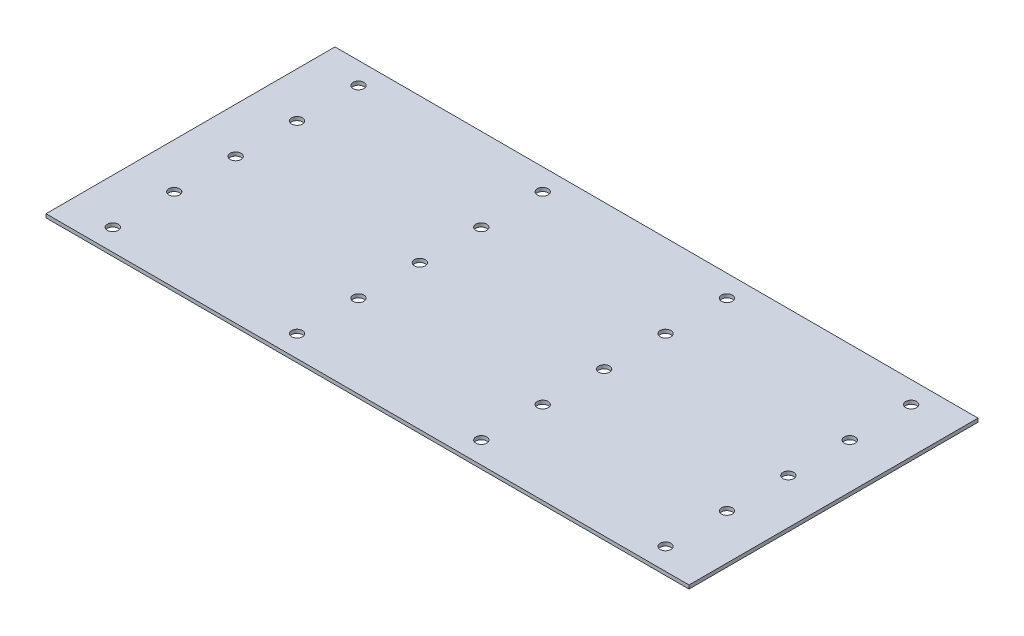
ISO-10303-21;
HEADER;
FILE_DESCRIPTION(('STEP AP214'),'2;1');
FILE_NAME('part.step','',(''),(''),'','','');
FILE_SCHEMA(('AUTOMOTIVE_DESIGN { 1 0 10303 214 1 1 1 1 }'));
ENDSEC;
DATA;
#1=APPLICATION_CONTEXT('core data for automotive mechanical design processes');
#2=APPLICATION_PROTOCOL_DEFINITION('international standard','automotive_design',2000,#1);
#3=PRODUCT_CONTEXT('',#1,'mechanical');
#4=PRODUCT('Part','Part','',(#3));
#5=PRODUCT_RELATED_PRODUCT_CATEGORY('part','',(#4));
#6=PRODUCT_DEFINITION_FORMATION('','',#4);
#7=PRODUCT_DEFINITION_CONTEXT('part definition',#1,'design');
#8=PRODUCT_DEFINITION('design','',#6,#7);
#9=PRODUCT_DEFINITION_SHAPE('','',#8);
#10=(LENGTH_UNIT() NAMED_UNIT(*) SI_UNIT(.MILLI.,.METRE.));
#11=(NAMED_UNIT(*) PLANE_ANGLE_UNIT() SI_UNIT($,.RADIAN.));
#12=(NAMED_UNIT(*) SI_UNIT($,.STERADIAN.) SOLID_ANGLE_UNIT());
#13=UNCERTAINTY_MEASURE_WITH_UNIT(LENGTH_MEASURE(1.E-05),#10,'distance_accuracy_value','');
#14=(GEOMETRIC_REPRESENTATION_CONTEXT(3) GLOBAL_UNCERTAINTY_ASSIGNED_CONTEXT((#13)) GLOBAL_UNIT_ASSIGNED_CONTEXT((#10,
#11,#12)) REPRESENTATION_CONTEXT('',''));
#15=CARTESIAN_POINT('',(0.,0.,0.));
#16=DIRECTION('',(0.,0.,1.));
#17=DIRECTION('',(1.,0.,0.));
#18=AXIS2_PLACEMENT_3D('',#15,#16,#17);
#19=CARTESIAN_POINT('',(89.,1.,40.));
#20=DIRECTION('',(-1.,0.,0.));
#21=DIRECTION('',(0.,0.,1.));
#22=AXIS2_PLACEMENT_3D('',#19,#20,#21);
#23=PLANE('',#22);
#24=DIRECTION('',(0.,0.,-1.));
#25=VECTOR('',#24,1.);
#26=CARTESIAN_POINT('',(89.,0.,40.));
#27=LINE('',#26,#25);
#28=CARTESIAN_POINT('',(89.,0.,40.));
#29=VERTEX_POINT('',#28);
#30=CARTESIAN_POINT('',(89.,0.,-40.));
#31=VERTEX_POINT('',#30);
#32=EDGE_CURVE('E102',#29,#31,#27,.T.);
#33=ORIENTED_EDGE('',*,*,#32,.T.);
#34=DIRECTION('',(0.,-1.,0.));
#35=VECTOR('',#34,1.);
#36=CARTESIAN_POINT('',(89.,1.,-40.));
#37=LINE('',#36,#35);
#38=CARTESIAN_POINT('',(89.,1.,-40.));
#39=VERTEX_POINT('',#38);
#40=EDGE_CURVE('E11',#39,#31,#37,.T.);
#41=ORIENTED_EDGE('',*,*,#40,.F.);
#42=DIRECTION('',(0.,0.,-1.));
#43=VECTOR('',#42,1.);
#44=CARTESIAN_POINT('',(89.,1.,40.));
#45=LINE('',#44,#43);
#46=CARTESIAN_POINT('',(89.,1.,40.));
#47=VERTEX_POINT('',#46);
#48=EDGE_CURVE('E90',#47,#39,#45,.T.);
#49=ORIENTED_EDGE('',*,*,#48,.F.);
#50=DIRECTION('',(0.,-1.,0.));
#51=VECTOR('',#50,1.);
#52=CARTESIAN_POINT('',(89.,1.,40.));
#53=LINE('',#52,#51);
#54=EDGE_CURVE('E98',#47,#29,#53,.T.);
#55=ORIENTED_EDGE('',*,*,#54,.T.);
#56=EDGE_LOOP('',(#33,#41,#49,#55));
#57=FACE_BOUND('',#56,.T.);
#58=ADVANCED_FACE('F39',(#57),#23,.F.);
#59=CARTESIAN_POINT('',(-89.,1.,-40.));
#60=DIRECTION('',(0.,0.,1.));
#61=DIRECTION('',(1.,0.,0.));
#62=AXIS2_PLACEMENT_3D('',#59,#60,#61);
#63=PLANE('',#62);
#64=DIRECTION('',(-1.,0.,0.));
#65=VECTOR('',#64,1.);
#66=CARTESIAN_POINT('',(-89.,0.,-40.));
#67=LINE('',#66,#65);
#68=CARTESIAN_POINT('',(-89.,0.,-40.));
#69=VERTEX_POINT('',#68);
#70=EDGE_CURVE('E94',#31,#69,#67,.T.);
#71=ORIENTED_EDGE('',*,*,#70,.T.);
#72=DIRECTION('',(0.,-1.,0.));
#73=VECTOR('',#72,1.);
#74=CARTESIAN_POINT('',(-89.,1.,-40.));
#75=LINE('',#74,#73);
#76=CARTESIAN_POINT('',(-89.,1.,-40.));
#77=VERTEX_POINT('',#76);
#78=EDGE_CURVE('E47',#77,#69,#75,.T.);
#79=ORIENTED_EDGE('',*,*,#78,.F.);
#80=DIRECTION('',(-1.,0.,0.));
#81=VECTOR('',#80,1.);
#82=CARTESIAN_POINT('',(-89.,1.,-40.));
#83=LINE('',#82,#81);
#84=EDGE_CURVE('E85',#39,#77,#83,.T.);
#85=ORIENTED_EDGE('',*,*,#84,.F.);
#86=ORIENTED_EDGE('',*,*,#40,.T.);
#87=EDGE_LOOP('',(#71,#79,#85,#86));
#88=FACE_BOUND('',#87,.T.);
#89=ADVANCED_FACE('F93',(#88),#63,.F.);
#90=CARTESIAN_POINT('',(-89.,1.,40.));
#91=DIRECTION('',(1.,0.,0.));
#92=DIRECTION('',(0.,0.,-1.));
#93=AXIS2_PLACEMENT_3D('',#90,#91,#92);
#94=PLANE('',#93);
#95=DIRECTION('',(0.,0.,1.));
#96=VECTOR('',#95,1.);
#97=CARTESIAN_POINT('',(-89.,0.,40.));
#98=LINE('',#97,#96);
#99=CARTESIAN_POINT('',(-89.,0.,40.));
#100=VERTEX_POINT('',#99);
#101=EDGE_CURVE('E72',#69,#100,#98,.T.);
#102=ORIENTED_EDGE('',*,*,#101,.T.);
#103=DIRECTION('',(0.,-1.,0.));
#104=VECTOR('',#103,1.);
#105=CARTESIAN_POINT('',(-89.,1.,40.));
#106=LINE('',#105,#104);
#107=CARTESIAN_POINT('',(-89.,1.,40.));
#108=VERTEX_POINT('',#107);
#109=EDGE_CURVE('E95',#108,#100,#106,.T.);
#110=ORIENTED_EDGE('',*,*,#109,.F.);
#111=DIRECTION('',(0.,0.,1.));
#112=VECTOR('',#111,1.);
#113=CARTESIAN_POINT('',(-89.,1.,40.));
#114=LINE('',#113,#112);
#115=EDGE_CURVE('E88',#77,#108,#114,.T.);
#116=ORIENTED_EDGE('',*,*,#115,.F.);
#117=ORIENTED_EDGE('',*,*,#78,.T.);
#118=EDGE_LOOP('',(#102,#110,#116,#117));
#119=FACE_BOUND('',#118,.T.);
#120=ADVANCED_FACE('F96',(#119),#94,.F.);
#121=CARTESIAN_POINT('',(-89.,1.,40.));
#122=DIRECTION('',(0.,0.,-1.));
#123=DIRECTION('',(-1.,0.,0.));
#124=AXIS2_PLACEMENT_3D('',#121,#122,#123);
#125=PLANE('',#124);
#126=DIRECTION('',(1.,0.,0.));
#127=VECTOR('',#126,1.);
#128=CARTESIAN_POINT('',(-89.,0.,40.));
#129=LINE('',#128,#127);
#130=EDGE_CURVE('E78',#100,#29,#129,.T.);
#131=ORIENTED_EDGE('',*,*,#130,.T.);
#132=ORIENTED_EDGE('',*,*,#54,.F.);
#133=DIRECTION('',(1.,0.,0.));
#134=VECTOR('',#133,1.);
#135=CARTESIAN_POINT('',(-89.,1.,40.));
#136=LINE('',#135,#134);
#137=EDGE_CURVE('E55',#108,#47,#136,.T.);
#138=ORIENTED_EDGE('',*,*,#137,.F.);
#139=ORIENTED_EDGE('',*,*,#109,.T.);
#140=EDGE_LOOP('',(#131,#132,#138,#139));
#141=FACE_BOUND('',#140,.T.);
#142=ADVANCED_FACE('F110',(#141),#125,.F.);
#143=CARTESIAN_POINT('',(0.,1.,0.));
#144=DIRECTION('',(0.,-1.,0.));
#145=DIRECTION('',(0.,0.,-1.));
#146=AXIS2_PLACEMENT_3D('',#143,#144,#145);
#147=PLANE('',#146);
#148=CARTESIAN_POINT('',(25.5,1.,0.));
#149=DIRECTION('',(0.,1.,0.));
#150=DIRECTION('',(0.,0.,1.));
#151=AXIS2_PLACEMENT_3D('',#148,#149,#150);
#152=CIRCLE('',#151,1.5);
#153=CARTESIAN_POINT('',(25.5,1.,1.5));
#154=VERTEX_POINT('',#153);
#155=EDGE_CURVE('E185',#154,#154,#152,.T.);
#156=ORIENTED_EDGE('',*,*,#155,.F.);
#157=EDGE_LOOP('',(#156));
#158=FACE_BOUND('',#157,.T.);
#159=CARTESIAN_POINT('',(25.5,1.,-17.));
#160=DIRECTION('',(0.,1.,0.));
#161=DIRECTION('',(0.,0.,1.));
#162=AXIS2_PLACEMENT_3D('',#159,#160,#161);
#163=CIRCLE('',#162,1.5);
#164=CARTESIAN_POINT('',(25.5,1.,-15.5));
#165=VERTEX_POINT('',#164);
#166=EDGE_CURVE('E174',#165,#165,#163,.T.);
#167=ORIENTED_EDGE('',*,*,#166,.F.);
#168=EDGE_LOOP('',(#167));
#169=FACE_BOUND('',#168,.T.);
#170=CARTESIAN_POINT('',(25.5,1.,-34.));
#171=DIRECTION('',(0.,1.,0.));
#172=DIRECTION('',(0.,0.,1.));
#173=AXIS2_PLACEMENT_3D('',#170,#171,#172);
#174=CIRCLE('',#173,1.5);
#175=CARTESIAN_POINT('',(25.5,1.,-32.5));
#176=VERTEX_POINT('',#175);
#177=EDGE_CURVE('E173',#176,#176,#174,.T.);
#178=ORIENTED_EDGE('',*,*,#177,.F.);
#179=EDGE_LOOP('',(#178));
#180=FACE_BOUND('',#179,.T.);
#181=CARTESIAN_POINT('',(-25.5,1.,34.));
#182=DIRECTION('',(0.,1.,0.));
#183=DIRECTION('',(0.,0.,1.));
#184=AXIS2_PLACEMENT_3D('',#181,#182,#183);
#185=CIRCLE('',#184,1.5);
#186=CARTESIAN_POINT('',(-25.5,1.,35.5));
#187=VERTEX_POINT('',#186);
#188=EDGE_CURVE('E126',#187,#187,#185,.T.);
#189=ORIENTED_EDGE('',*,*,#188,.F.);
#190=EDGE_LOOP('',(#189));
#191=FACE_BOUND('',#190,.T.);
#192=CARTESIAN_POINT('',(25.5,1.,17.));
#193=DIRECTION('',(0.,1.,0.));
#194=DIRECTION('',(0.,0.,1.));
#195=AXIS2_PLACEMENT_3D('',#192,#193,#194);
#196=CIRCLE('',#195,1.5);
#197=CARTESIAN_POINT('',(25.5,1.,18.5));
#198=VERTEX_POINT('',#197);
#199=EDGE_CURVE('E186',#198,#198,#196,.T.);
#200=ORIENTED_EDGE('',*,*,#199,.F.);
#201=EDGE_LOOP('',(#200));
#202=FACE_BOUND('',#201,.T.);
#203=CARTESIAN_POINT('',(25.5,1.,34.));
#204=DIRECTION('',(0.,1.,0.));
#205=DIRECTION('',(0.,0.,1.));
#206=AXIS2_PLACEMENT_3D('',#203,#204,#205);
#207=CIRCLE('',#206,1.5);
#208=CARTESIAN_POINT('',(25.5,1.,35.5));
#209=VERTEX_POINT('',#208);
#210=EDGE_CURVE('E210',#209,#209,#207,.T.);
#211=ORIENTED_EDGE('',*,*,#210,.F.);
#212=EDGE_LOOP('',(#211));
#213=FACE_BOUND('',#212,.T.);
#214=CARTESIAN_POINT('',(76.5,1.,-34.));
#215=DIRECTION('',(0.,1.,0.));
#216=DIRECTION('',(0.,0.,1.));
#217=AXIS2_PLACEMENT_3D('',#214,#215,#216);
#218=CIRCLE('',#217,1.5);
#219=CARTESIAN_POINT('',(76.5,1.,-32.5));
#220=VERTEX_POINT('',#219);
#221=EDGE_CURVE('E204',#220,#220,#218,.T.);
#222=ORIENTED_EDGE('',*,*,#221,.F.);
#223=EDGE_LOOP('',(#222));
#224=FACE_BOUND('',#223,.T.);
#225=CARTESIAN_POINT('',(76.5,1.,-17.));
#226=DIRECTION('',(0.,1.,0.));
#227=DIRECTION('',(0.,0.,1.));
#228=AXIS2_PLACEMENT_3D('',#225,#226,#227);
#229=CIRCLE('',#228,1.5);
#230=CARTESIAN_POINT('',(76.5,1.,-15.5));
#231=VERTEX_POINT('',#230);
#232=EDGE_CURVE('E197',#231,#231,#229,.T.);
#233=ORIENTED_EDGE('',*,*,#232,.F.);
#234=EDGE_LOOP('',(#233));
#235=FACE_BOUND('',#234,.T.);
#236=CARTESIAN_POINT('',(-25.5,1.,17.));
#237=DIRECTION('',(0.,1.,0.));
#238=DIRECTION('',(0.,0.,1.));
#239=AXIS2_PLACEMENT_3D('',#236,#237,#238);
#240=CIRCLE('',#239,1.5);
#241=CARTESIAN_POINT('',(-25.5,1.,18.5));
#242=VERTEX_POINT('',#241);
#243=EDGE_CURVE('E125',#242,#242,#240,.T.);
#244=ORIENTED_EDGE('',*,*,#243,.F.);
#245=EDGE_LOOP('',(#244));
#246=FACE_BOUND('',#245,.T.);
#247=CARTESIAN_POINT('',(-25.5,1.,0.));
#248=DIRECTION('',(0.,1.,0.));
#249=DIRECTION('',(0.,0.,1.));
#250=AXIS2_PLACEMENT_3D('',#247,#248,#249);
#251=CIRCLE('',#250,1.5);
#252=CARTESIAN_POINT('',(-25.5,1.,1.5));
#253=VERTEX_POINT('',#252);
#254=EDGE_CURVE('E132',#253,#253,#251,.T.);
#255=ORIENTED_EDGE('',*,*,#254,.F.);
#256=EDGE_LOOP('',(#255));
#257=FACE_BOUND('',#256,.T.);
#258=CARTESIAN_POINT('',(-25.5,1.,-17.));
#259=DIRECTION('',(0.,1.,0.));
#260=DIRECTION('',(0.,0.,1.));
#261=AXIS2_PLACEMENT_3D('',#258,#259,#260);
#262=CIRCLE('',#261,1.5);
#263=CARTESIAN_POINT('',(-25.5,1.,-15.5));
#264=VERTEX_POINT('',#263);
#265=EDGE_CURVE('E138',#264,#264,#262,.T.);
#266=ORIENTED_EDGE('',*,*,#265,.F.);
#267=EDGE_LOOP('',(#266));
#268=FACE_BOUND('',#267,.T.);
#269=CARTESIAN_POINT('',(-25.5,1.,-34.));
#270=DIRECTION('',(0.,1.,0.));
#271=DIRECTION('',(0.,0.,1.));
#272=AXIS2_PLACEMENT_3D('',#269,#270,#271);
#273=CIRCLE('',#272,1.5);
#274=CARTESIAN_POINT('',(-25.5,1.,-32.5));
#275=VERTEX_POINT('',#274);
#276=EDGE_CURVE('E144',#275,#275,#273,.T.);
#277=ORIENTED_EDGE('',*,*,#276,.F.);
#278=EDGE_LOOP('',(#277));
#279=FACE_BOUND('',#278,.T.);
#280=CARTESIAN_POINT('',(-76.5,1.,34.));
#281=DIRECTION('',(0.,1.,0.));
#282=DIRECTION('',(0.,0.,1.));
#283=AXIS2_PLACEMENT_3D('',#280,#281,#282);
#284=CIRCLE('',#283,1.5);
#285=CARTESIAN_POINT('',(-76.5,1.,35.5));
#286=VERTEX_POINT('',#285);
#287=EDGE_CURVE('E150',#286,#286,#284,.T.);
#288=ORIENTED_EDGE('',*,*,#287,.F.);
#289=EDGE_LOOP('',(#288));
#290=FACE_BOUND('',#289,.T.);
#291=CARTESIAN_POINT('',(-76.5,1.,17.));
#292=DIRECTION('',(0.,1.,0.));
#293=DIRECTION('',(0.,0.,1.));
#294=AXIS2_PLACEMENT_3D('',#291,#292,#293);
#295=CIRCLE('',#294,1.5);
#296=CARTESIAN_POINT('',(-76.5,1.,18.5));
#297=VERTEX_POINT('',#296);
#298=EDGE_CURVE('E156',#297,#297,#295,.T.);
#299=ORIENTED_EDGE('',*,*,#298,.F.);
#300=EDGE_LOOP('',(#299));
#301=FACE_BOUND('',#300,.T.);
#302=CARTESIAN_POINT('',(-76.5,1.,0.));
#303=DIRECTION('',(0.,1.,0.));
#304=DIRECTION('',(0.,0.,1.));
#305=AXIS2_PLACEMENT_3D('',#302,#303,#304);
#306=CIRCLE('',#305,1.5);
#307=CARTESIAN_POINT('',(-76.5,1.,1.5));
#308=VERTEX_POINT('',#307);
#309=EDGE_CURVE('E162',#308,#308,#306,.T.);
#310=ORIENTED_EDGE('',*,*,#309,.F.);
#311=EDGE_LOOP('',(#310));
#312=FACE_BOUND('',#311,.T.);
#313=CARTESIAN_POINT('',(-76.5,1.,-17.));
#314=DIRECTION('',(0.,1.,0.));
#315=DIRECTION('',(0.,0.,1.));
#316=AXIS2_PLACEMENT_3D('',#313,#314,#315);
#317=CIRCLE('',#316,1.5);
#318=CARTESIAN_POINT('',(-76.5,1.,-15.5));
#319=VERTEX_POINT('',#318);
#320=EDGE_CURVE('E119',#319,#319,#317,.T.);
#321=ORIENTED_EDGE('',*,*,#320,.F.);
#322=EDGE_LOOP('',(#321));
#323=FACE_BOUND('',#322,.T.);
#324=CARTESIAN_POINT('',(76.5,1.,0.));
#325=DIRECTION('',(0.,1.,0.));
#326=DIRECTION('',(0.,0.,1.));
#327=AXIS2_PLACEMENT_3D('',#324,#325,#326);
#328=CIRCLE('',#327,1.5);
#329=CARTESIAN_POINT('',(76.5,1.,1.5));
#330=VERTEX_POINT('',#329);
#331=EDGE_CURVE('E198',#330,#330,#328,.T.);
#332=ORIENTED_EDGE('',*,*,#331,.F.);
#333=EDGE_LOOP('',(#332));
#334=FACE_BOUND('',#333,.T.);
#335=CARTESIAN_POINT('',(76.5,1.,17.));
#336=DIRECTION('',(0.,1.,0.));
#337=DIRECTION('',(0.,0.,1.));
#338=AXIS2_PLACEMENT_3D('',#335,#336,#337);
#339=CIRCLE('',#338,1.5);
#340=CARTESIAN_POINT('',(76.5,1.,18.5));
#341=VERTEX_POINT('',#340);
#342=EDGE_CURVE('E227',#341,#341,#339,.T.);
#343=ORIENTED_EDGE('',*,*,#342,.F.);
#344=EDGE_LOOP('',(#343));
#345=FACE_BOUND('',#344,.T.);
#346=CARTESIAN_POINT('',(76.5,1.,34.));
#347=DIRECTION('',(0.,1.,0.));
#348=DIRECTION('',(0.,0.,1.));
#349=AXIS2_PLACEMENT_3D('',#346,#347,#348);
#350=CIRCLE('',#349,1.5);
#351=CARTESIAN_POINT('',(76.5,1.,35.5));
#352=VERTEX_POINT('',#351);
#353=EDGE_CURVE('E221',#352,#352,#350,.T.);
#354=ORIENTED_EDGE('',*,*,#353,.F.);
#355=EDGE_LOOP('',(#354));
#356=FACE_BOUND('',#355,.T.);
#357=CARTESIAN_POINT('',(-76.5,1.,-34.));
#358=DIRECTION('',(0.,1.,0.));
#359=DIRECTION('',(0.,0.,1.));
#360=AXIS2_PLACEMENT_3D('',#357,#358,#359);
#361=CIRCLE('',#360,1.5);
#362=CARTESIAN_POINT('',(-76.5,1.,-32.5));
#363=VERTEX_POINT('',#362);
#364=EDGE_CURVE('E116',#363,#363,#361,.T.);
#365=ORIENTED_EDGE('',*,*,#364,.F.);
#366=EDGE_LOOP('',(#365));
#367=FACE_BOUND('',#366,.T.);
#368=ORIENTED_EDGE('',*,*,#48,.T.);
#369=ORIENTED_EDGE('',*,*,#84,.T.);
#370=ORIENTED_EDGE('',*,*,#115,.T.);
#371=ORIENTED_EDGE('',*,*,#137,.T.);
#372=EDGE_LOOP('',(#368,#369,#370,#371));
#373=FACE_BOUND('',#372,.T.);
#374=ADVANCED_FACE('F86',(#158,#169,#180,#191,#202,#213,#224,#235,#246,#257,#268,#279,#290,#301,
#312,#323,#334,#345,#356,#367,#373),#147,.F.);
#375=CARTESIAN_POINT('',(0.,0.,0.));
#376=DIRECTION('',(0.,-1.,0.));
#377=DIRECTION('',(0.,0.,-1.));
#378=AXIS2_PLACEMENT_3D('',#375,#376,#377);
#379=PLANE('',#378);
#380=CARTESIAN_POINT('',(25.5,0.,0.));
#381=DIRECTION('',(0.,1.,0.));
#382=DIRECTION('',(0.,0.,1.));
#383=AXIS2_PLACEMENT_3D('',#380,#381,#382);
#384=CIRCLE('',#383,1.5);
#385=CARTESIAN_POINT('',(25.5,0.,1.5));
#386=VERTEX_POINT('',#385);
#387=EDGE_CURVE('E182',#386,#386,#384,.T.);
#388=ORIENTED_EDGE('',*,*,#387,.T.);
#389=EDGE_LOOP('',(#388));
#390=FACE_BOUND('',#389,.T.);
#391=CARTESIAN_POINT('',(25.5,0.,-17.));
#392=DIRECTION('',(0.,1.,0.));
#393=DIRECTION('',(0.,0.,1.));
#394=AXIS2_PLACEMENT_3D('',#391,#392,#393);
#395=CIRCLE('',#394,1.5);
#396=CARTESIAN_POINT('',(25.5,0.,-15.5));
#397=VERTEX_POINT('',#396);
#398=EDGE_CURVE('E189',#397,#397,#395,.T.);
#399=ORIENTED_EDGE('',*,*,#398,.T.);
#400=EDGE_LOOP('',(#399));
#401=FACE_BOUND('',#400,.T.);
#402=CARTESIAN_POINT('',(25.5,0.,-34.));
#403=DIRECTION('',(0.,1.,0.));
#404=DIRECTION('',(0.,0.,1.));
#405=AXIS2_PLACEMENT_3D('',#402,#403,#404);
#406=CIRCLE('',#405,1.5);
#407=CARTESIAN_POINT('',(25.5,0.,-32.5));
#408=VERTEX_POINT('',#407);
#409=EDGE_CURVE('E170',#408,#408,#406,.T.);
#410=ORIENTED_EDGE('',*,*,#409,.T.);
#411=EDGE_LOOP('',(#410));
#412=FACE_BOUND('',#411,.T.);
#413=CARTESIAN_POINT('',(-25.5,0.,34.));
#414=DIRECTION('',(0.,1.,0.));
#415=DIRECTION('',(0.,0.,1.));
#416=AXIS2_PLACEMENT_3D('',#413,#414,#415);
#417=CIRCLE('',#416,1.5);
#418=CARTESIAN_POINT('',(-25.5,0.,35.5));
#419=VERTEX_POINT('',#418);
#420=EDGE_CURVE('E177',#419,#419,#417,.T.);
#421=ORIENTED_EDGE('',*,*,#420,.T.);
#422=EDGE_LOOP('',(#421));
#423=FACE_BOUND('',#422,.T.);
#424=CARTESIAN_POINT('',(25.5,0.,17.));
#425=DIRECTION('',(0.,1.,0.));
#426=DIRECTION('',(0.,0.,1.));
#427=AXIS2_PLACEMENT_3D('',#424,#425,#426);
#428=CIRCLE('',#427,1.5);
#429=CARTESIAN_POINT('',(25.5,0.,18.5));
#430=VERTEX_POINT('',#429);
#431=EDGE_CURVE('E213',#430,#430,#428,.T.);
#432=ORIENTED_EDGE('',*,*,#431,.T.);
#433=EDGE_LOOP('',(#432));
#434=FACE_BOUND('',#433,.T.);
#435=CARTESIAN_POINT('',(25.5,0.,34.));
#436=DIRECTION('',(0.,1.,0.));
#437=DIRECTION('',(0.,0.,1.));
#438=AXIS2_PLACEMENT_3D('',#435,#436,#437);
#439=CIRCLE('',#438,1.5);
#440=CARTESIAN_POINT('',(25.5,0.,35.5));
#441=VERTEX_POINT('',#440);
#442=EDGE_CURVE('E207',#441,#441,#439,.T.);
#443=ORIENTED_EDGE('',*,*,#442,.T.);
#444=EDGE_LOOP('',(#443));
#445=FACE_BOUND('',#444,.T.);
#446=CARTESIAN_POINT('',(76.5,0.,-34.));
#447=DIRECTION('',(0.,1.,0.));
#448=DIRECTION('',(0.,0.,1.));
#449=AXIS2_PLACEMENT_3D('',#446,#447,#448);
#450=CIRCLE('',#449,1.5);
#451=CARTESIAN_POINT('',(76.5,0.,-32.5));
#452=VERTEX_POINT('',#451);
#453=EDGE_CURVE('E201',#452,#452,#450,.T.);
#454=ORIENTED_EDGE('',*,*,#453,.T.);
#455=EDGE_LOOP('',(#454));
#456=FACE_BOUND('',#455,.T.);
#457=CARTESIAN_POINT('',(76.5,0.,-17.));
#458=DIRECTION('',(0.,1.,0.));
#459=DIRECTION('',(0.,0.,1.));
#460=AXIS2_PLACEMENT_3D('',#457,#458,#459);
#461=CIRCLE('',#460,1.5);
#462=CARTESIAN_POINT('',(76.5,0.,-15.5));
#463=VERTEX_POINT('',#462);
#464=EDGE_CURVE('E194',#463,#463,#461,.T.);
#465=ORIENTED_EDGE('',*,*,#464,.T.);
#466=EDGE_LOOP('',(#465));
#467=FACE_BOUND('',#466,.T.);
#468=CARTESIAN_POINT('',(-25.5,0.,17.));
#469=DIRECTION('',(0.,1.,0.));
#470=DIRECTION('',(0.,0.,1.));
#471=AXIS2_PLACEMENT_3D('',#468,#469,#470);
#472=CIRCLE('',#471,1.5);
#473=CARTESIAN_POINT('',(-25.5,0.,18.5));
#474=VERTEX_POINT('',#473);
#475=EDGE_CURVE('E122',#474,#474,#472,.T.);
#476=ORIENTED_EDGE('',*,*,#475,.T.);
#477=EDGE_LOOP('',(#476));
#478=FACE_BOUND('',#477,.T.);
#479=CARTESIAN_POINT('',(-25.5,0.,0.));
#480=DIRECTION('',(0.,1.,0.));
#481=DIRECTION('',(0.,0.,1.));
#482=AXIS2_PLACEMENT_3D('',#479,#480,#481);
#483=CIRCLE('',#482,1.5);
#484=CARTESIAN_POINT('',(-25.5,0.,1.5));
#485=VERTEX_POINT('',#484);
#486=EDGE_CURVE('E129',#485,#485,#483,.T.);
#487=ORIENTED_EDGE('',*,*,#486,.T.);
#488=EDGE_LOOP('',(#487));
#489=FACE_BOUND('',#488,.T.);
#490=CARTESIAN_POINT('',(-25.5,0.,-17.));
#491=DIRECTION('',(0.,1.,0.));
#492=DIRECTION('',(0.,0.,1.));
#493=AXIS2_PLACEMENT_3D('',#490,#491,#492);
#494=CIRCLE('',#493,1.5);
#495=CARTESIAN_POINT('',(-25.5,0.,-15.5));
#496=VERTEX_POINT('',#495);
#497=EDGE_CURVE('E135',#496,#496,#494,.T.);
#498=ORIENTED_EDGE('',*,*,#497,.T.);
#499=EDGE_LOOP('',(#498));
#500=FACE_BOUND('',#499,.T.);
#501=CARTESIAN_POINT('',(-25.5,0.,-34.));
#502=DIRECTION('',(0.,1.,0.));
#503=DIRECTION('',(0.,0.,1.));
#504=AXIS2_PLACEMENT_3D('',#501,#502,#503);
#505=CIRCLE('',#504,1.5);
#506=CARTESIAN_POINT('',(-25.5,0.,-32.5));
#507=VERTEX_POINT('',#506);
#508=EDGE_CURVE('E141',#507,#507,#505,.T.);
#509=ORIENTED_EDGE('',*,*,#508,.T.);
#510=EDGE_LOOP('',(#509));
#511=FACE_BOUND('',#510,.T.);
#512=CARTESIAN_POINT('',(-76.5,0.,34.));
#513=DIRECTION('',(0.,1.,0.));
#514=DIRECTION('',(0.,0.,1.));
#515=AXIS2_PLACEMENT_3D('',#512,#513,#514);
#516=CIRCLE('',#515,1.5);
#517=CARTESIAN_POINT('',(-76.5,0.,35.5));
#518=VERTEX_POINT('',#517);
#519=EDGE_CURVE('E147',#518,#518,#516,.T.);
#520=ORIENTED_EDGE('',*,*,#519,.T.);
#521=EDGE_LOOP('',(#520));
#522=FACE_BOUND('',#521,.T.);
#523=CARTESIAN_POINT('',(-76.5,0.,17.));
#524=DIRECTION('',(0.,1.,0.));
#525=DIRECTION('',(0.,0.,1.));
#526=AXIS2_PLACEMENT_3D('',#523,#524,#525);
#527=CIRCLE('',#526,1.5);
#528=CARTESIAN_POINT('',(-76.5,0.,18.5));
#529=VERTEX_POINT('',#528);
#530=EDGE_CURVE('E153',#529,#529,#527,.T.);
#531=ORIENTED_EDGE('',*,*,#530,.T.);
#532=EDGE_LOOP('',(#531));
#533=FACE_BOUND('',#532,.T.);
#534=CARTESIAN_POINT('',(-76.5,0.,0.));
#535=DIRECTION('',(0.,1.,0.));
#536=DIRECTION('',(0.,0.,1.));
#537=AXIS2_PLACEMENT_3D('',#534,#535,#536);
#538=CIRCLE('',#537,1.5);
#539=CARTESIAN_POINT('',(-76.5,0.,1.5));
#540=VERTEX_POINT('',#539);
#541=EDGE_CURVE('E159',#540,#540,#538,.T.);
#542=ORIENTED_EDGE('',*,*,#541,.T.);
#543=EDGE_LOOP('',(#542));
#544=FACE_BOUND('',#543,.T.);
#545=CARTESIAN_POINT('',(-76.5,0.,-17.));
#546=DIRECTION('',(0.,1.,0.));
#547=DIRECTION('',(0.,0.,1.));
#548=AXIS2_PLACEMENT_3D('',#545,#546,#547);
#549=CIRCLE('',#548,1.5);
#550=CARTESIAN_POINT('',(-76.5,0.,-15.5));
#551=VERTEX_POINT('',#550);
#552=EDGE_CURVE('E165',#551,#551,#549,.T.);
#553=ORIENTED_EDGE('',*,*,#552,.T.);
#554=EDGE_LOOP('',(#553));
#555=FACE_BOUND('',#554,.T.);
#556=CARTESIAN_POINT('',(76.5,0.,0.));
#557=DIRECTION('',(0.,1.,0.));
#558=DIRECTION('',(0.,0.,1.));
#559=AXIS2_PLACEMENT_3D('',#556,#557,#558);
#560=CIRCLE('',#559,1.5);
#561=CARTESIAN_POINT('',(76.5,0.,1.5));
#562=VERTEX_POINT('',#561);
#563=EDGE_CURVE('E230',#562,#562,#560,.T.);
#564=ORIENTED_EDGE('',*,*,#563,.T.);
#565=EDGE_LOOP('',(#564));
#566=FACE_BOUND('',#565,.T.);
#567=CARTESIAN_POINT('',(76.5,0.,17.));
#568=DIRECTION('',(0.,1.,0.));
#569=DIRECTION('',(0.,0.,1.));
#570=AXIS2_PLACEMENT_3D('',#567,#568,#569);
#571=CIRCLE('',#570,1.5);
#572=CARTESIAN_POINT('',(76.5,0.,18.5));
#573=VERTEX_POINT('',#572);
#574=EDGE_CURVE('E224',#573,#573,#571,.T.);
#575=ORIENTED_EDGE('',*,*,#574,.T.);
#576=EDGE_LOOP('',(#575));
#577=FACE_BOUND('',#576,.T.);
#578=CARTESIAN_POINT('',(76.5,0.,34.));
#579=DIRECTION('',(0.,1.,0.));
#580=DIRECTION('',(0.,0.,1.));
#581=AXIS2_PLACEMENT_3D('',#578,#579,#580);
#582=CIRCLE('',#581,1.5);
#583=CARTESIAN_POINT('',(76.5,0.,35.5));
#584=VERTEX_POINT('',#583);
#585=EDGE_CURVE('E218',#584,#584,#582,.T.);
#586=ORIENTED_EDGE('',*,*,#585,.T.);
#587=EDGE_LOOP('',(#586));
#588=FACE_BOUND('',#587,.T.);
#589=CARTESIAN_POINT('',(-76.5,0.,-34.));
#590=DIRECTION('',(0.,1.,0.));
#591=DIRECTION('',(0.,0.,1.));
#592=AXIS2_PLACEMENT_3D('',#589,#590,#591);
#593=CIRCLE('',#592,1.5);
#594=CARTESIAN_POINT('',(-76.5,0.,-32.5));
#595=VERTEX_POINT('',#594);
#596=EDGE_CURVE('E105',#595,#595,#593,.T.);
#597=ORIENTED_EDGE('',*,*,#596,.T.);
#598=EDGE_LOOP('',(#597));
#599=FACE_BOUND('',#598,.T.);
#600=ORIENTED_EDGE('',*,*,#32,.F.);
#601=ORIENTED_EDGE('',*,*,#130,.F.);
#602=ORIENTED_EDGE('',*,*,#101,.F.);
#603=ORIENTED_EDGE('',*,*,#70,.F.);
#604=EDGE_LOOP('',(#600,#601,#602,#603));
#605=FACE_BOUND('',#604,.T.);
#606=ADVANCED_FACE('F113',(#390,#401,#412,#423,#434,#445,#456,#467,#478,#489,#500,#511,#522,
#533,#544,#555,#566,#577,#588,#599,#605),#379,.T.);
#607=CARTESIAN_POINT('',(-76.5,0.,-34.));
#608=DIRECTION('',(0.,1.,0.));
#609=DIRECTION('',(0.,0.,1.));
#610=AXIS2_PLACEMENT_3D('',#607,#608,#609);
#611=CYLINDRICAL_SURFACE('',#610,1.5);
#612=ORIENTED_EDGE('',*,*,#596,.F.);
#613=EDGE_LOOP('',(#612));
#614=FACE_BOUND('',#613,.T.);
#615=ORIENTED_EDGE('',*,*,#364,.T.);
#616=EDGE_LOOP('',(#615));
#617=FACE_BOUND('',#616,.T.);
#618=ADVANCED_FACE('F248',(#614,#617),#611,.F.);
#619=CARTESIAN_POINT('',(76.5,0.,34.));
#620=DIRECTION('',(0.,1.,0.));
#621=DIRECTION('',(0.,0.,1.));
#622=AXIS2_PLACEMENT_3D('',#619,#620,#621);
#623=CYLINDRICAL_SURFACE('',#622,1.5);
#624=ORIENTED_EDGE('',*,*,#585,.F.);
#625=EDGE_LOOP('',(#624));
#626=FACE_BOUND('',#625,.T.);
#627=ORIENTED_EDGE('',*,*,#353,.T.);
#628=EDGE_LOOP('',(#627));
#629=FACE_BOUND('',#628,.T.);
#630=ADVANCED_FACE('F250',(#626,#629),#623,.F.);
#631=CARTESIAN_POINT('',(76.5,0.,17.));
#632=DIRECTION('',(0.,1.,0.));
#633=DIRECTION('',(0.,0.,1.));
#634=AXIS2_PLACEMENT_3D('',#631,#632,#633);
#635=CYLINDRICAL_SURFACE('',#634,1.5);
#636=ORIENTED_EDGE('',*,*,#574,.F.);
#637=EDGE_LOOP('',(#636));
#638=FACE_BOUND('',#637,.T.);
#639=ORIENTED_EDGE('',*,*,#342,.T.);
#640=EDGE_LOOP('',(#639));
#641=FACE_BOUND('',#640,.T.);
#642=ADVANCED_FACE('F257',(#638,#641),#635,.F.);
#643=CARTESIAN_POINT('',(76.5,0.,0.));
#644=DIRECTION('',(0.,1.,0.));
#645=DIRECTION('',(0.,0.,1.));
#646=AXIS2_PLACEMENT_3D('',#643,#644,#645);
#647=CYLINDRICAL_SURFACE('',#646,1.5);
#648=ORIENTED_EDGE('',*,*,#563,.F.);
#649=EDGE_LOOP('',(#648));
#650=FACE_BOUND('',#649,.T.);
#651=ORIENTED_EDGE('',*,*,#331,.T.);
#652=EDGE_LOOP('',(#651));
#653=FACE_BOUND('',#652,.T.);
#654=ADVANCED_FACE('F236',(#650,#653),#647,.F.);
#655=CARTESIAN_POINT('',(-76.5,0.,-17.));
#656=DIRECTION('',(0.,1.,0.));
#657=DIRECTION('',(0.,0.,1.));
#658=AXIS2_PLACEMENT_3D('',#655,#656,#657);
#659=CYLINDRICAL_SURFACE('',#658,1.5);
#660=ORIENTED_EDGE('',*,*,#552,.F.);
#661=EDGE_LOOP('',(#660));
#662=FACE_BOUND('',#661,.T.);
#663=ORIENTED_EDGE('',*,*,#320,.T.);
#664=EDGE_LOOP('',(#663));
#665=FACE_BOUND('',#664,.T.);
#666=ADVANCED_FACE('F314',(#662,#665),#659,.F.);
#667=CARTESIAN_POINT('',(-76.5,0.,0.));
#668=DIRECTION('',(0.,1.,0.));
#669=DIRECTION('',(0.,0.,1.));
#670=AXIS2_PLACEMENT_3D('',#667,#668,#669);
#671=CYLINDRICAL_SURFACE('',#670,1.5);
#672=ORIENTED_EDGE('',*,*,#541,.F.);
#673=EDGE_LOOP('',(#672));
#674=FACE_BOUND('',#673,.T.);
#675=ORIENTED_EDGE('',*,*,#309,.T.);
#676=EDGE_LOOP('',(#675));
#677=FACE_BOUND('',#676,.T.);
#678=ADVANCED_FACE('F324',(#674,#677),#671,.F.);
#679=CARTESIAN_POINT('',(-76.5,0.,17.));
#680=DIRECTION('',(0.,1.,0.));
#681=DIRECTION('',(0.,0.,1.));
#682=AXIS2_PLACEMENT_3D('',#679,#680,#681);
#683=CYLINDRICAL_SURFACE('',#682,1.5);
#684=ORIENTED_EDGE('',*,*,#530,.F.);
#685=EDGE_LOOP('',(#684));
#686=FACE_BOUND('',#685,.T.);
#687=ORIENTED_EDGE('',*,*,#298,.T.);
#688=EDGE_LOOP('',(#687));
#689=FACE_BOUND('',#688,.T.);
#690=ADVANCED_FACE('F334',(#686,#689),#683,.F.);
#691=CARTESIAN_POINT('',(-76.5,0.,34.));
#692=DIRECTION('',(0.,1.,0.));
#693=DIRECTION('',(0.,0.,1.));
#694=AXIS2_PLACEMENT_3D('',#691,#692,#693);
#695=CYLINDRICAL_SURFACE('',#694,1.5);
#696=ORIENTED_EDGE('',*,*,#519,.F.);
#697=EDGE_LOOP('',(#696));
#698=FACE_BOUND('',#697,.T.);
#699=ORIENTED_EDGE('',*,*,#287,.T.);
#700=EDGE_LOOP('',(#699));
#701=FACE_BOUND('',#700,.T.);
#702=ADVANCED_FACE('F344',(#698,#701),#695,.F.);
#703=CARTESIAN_POINT('',(-25.5,0.,-34.));
#704=DIRECTION('',(0.,1.,0.));
#705=DIRECTION('',(0.,0.,1.));
#706=AXIS2_PLACEMENT_3D('',#703,#704,#705);
#707=CYLINDRICAL_SURFACE('',#706,1.5);
#708=ORIENTED_EDGE('',*,*,#508,.F.);
#709=EDGE_LOOP('',(#708));
#710=FACE_BOUND('',#709,.T.);
#711=ORIENTED_EDGE('',*,*,#276,.T.);
#712=EDGE_LOOP('',(#711));
#713=FACE_BOUND('',#712,.T.);
#714=ADVANCED_FACE('F354',(#710,#713),#707,.F.);
#715=CARTESIAN_POINT('',(-25.5,0.,-17.));
#716=DIRECTION('',(0.,1.,0.));
#717=DIRECTION('',(0.,0.,1.));
#718=AXIS2_PLACEMENT_3D('',#715,#716,#717);
#719=CYLINDRICAL_SURFACE('',#718,1.5);
#720=ORIENTED_EDGE('',*,*,#497,.F.);
#721=EDGE_LOOP('',(#720));
#722=FACE_BOUND('',#721,.T.);
#723=ORIENTED_EDGE('',*,*,#265,.T.);
#724=EDGE_LOOP('',(#723));
#725=FACE_BOUND('',#724,.T.);
#726=ADVANCED_FACE('F364',(#722,#725),#719,.F.);
#727=CARTESIAN_POINT('',(-25.5,0.,0.));
#728=DIRECTION('',(0.,1.,0.));
#729=DIRECTION('',(0.,0.,1.));
#730=AXIS2_PLACEMENT_3D('',#727,#728,#729);
#731=CYLINDRICAL_SURFACE('',#730,1.5);
#732=ORIENTED_EDGE('',*,*,#486,.F.);
#733=EDGE_LOOP('',(#732));
#734=FACE_BOUND('',#733,.T.);
#735=ORIENTED_EDGE('',*,*,#254,.T.);
#736=EDGE_LOOP('',(#735));
#737=FACE_BOUND('',#736,.T.);
#738=ADVANCED_FACE('F374',(#734,#737),#731,.F.);
#739=CARTESIAN_POINT('',(-25.5,0.,17.));
#740=DIRECTION('',(0.,1.,0.));
#741=DIRECTION('',(0.,0.,1.));
#742=AXIS2_PLACEMENT_3D('',#739,#740,#741);
#743=CYLINDRICAL_SURFACE('',#742,1.5);
#744=ORIENTED_EDGE('',*,*,#475,.F.);
#745=EDGE_LOOP('',(#744));
#746=FACE_BOUND('',#745,.T.);
#747=ORIENTED_EDGE('',*,*,#243,.T.);
#748=EDGE_LOOP('',(#747));
#749=FACE_BOUND('',#748,.T.);
#750=ADVANCED_FACE('F384',(#746,#749),#743,.F.);
#751=CARTESIAN_POINT('',(76.5,0.,-17.));
#752=DIRECTION('',(0.,1.,0.));
#753=DIRECTION('',(0.,0.,1.));
#754=AXIS2_PLACEMENT_3D('',#751,#752,#753);
#755=CYLINDRICAL_SURFACE('',#754,1.5);
#756=ORIENTED_EDGE('',*,*,#464,.F.);
#757=EDGE_LOOP('',(#756));
#758=FACE_BOUND('',#757,.T.);
#759=ORIENTED_EDGE('',*,*,#232,.T.);
#760=EDGE_LOOP('',(#759));
#761=FACE_BOUND('',#760,.T.);
#762=ADVANCED_FACE('F394',(#758,#761),#755,.F.);
#763=CARTESIAN_POINT('',(76.5,0.,-34.));
#764=DIRECTION('',(0.,1.,0.));
#765=DIRECTION('',(0.,0.,1.));
#766=AXIS2_PLACEMENT_3D('',#763,#764,#765);
#767=CYLINDRICAL_SURFACE('',#766,1.5);
#768=ORIENTED_EDGE('',*,*,#453,.F.);
#769=EDGE_LOOP('',(#768));
#770=FACE_BOUND('',#769,.T.);
#771=ORIENTED_EDGE('',*,*,#221,.T.);
#772=EDGE_LOOP('',(#771));
#773=FACE_BOUND('',#772,.T.);
#774=ADVANCED_FACE('F403',(#770,#773),#767,.F.);
#775=CARTESIAN_POINT('',(25.5,0.,34.));
#776=DIRECTION('',(0.,1.,0.));
#777=DIRECTION('',(0.,0.,1.));
#778=AXIS2_PLACEMENT_3D('',#775,#776,#777);
#779=CYLINDRICAL_SURFACE('',#778,1.5);
#780=ORIENTED_EDGE('',*,*,#442,.F.);
#781=EDGE_LOOP('',(#780));
#782=FACE_BOUND('',#781,.T.);
#783=ORIENTED_EDGE('',*,*,#210,.T.);
#784=EDGE_LOOP('',(#783));
#785=FACE_BOUND('',#784,.T.);
#786=ADVANCED_FACE('F413',(#782,#785),#779,.F.);
#787=CARTESIAN_POINT('',(25.5,0.,17.));
#788=DIRECTION('',(0.,1.,0.));
#789=DIRECTION('',(0.,0.,1.));
#790=AXIS2_PLACEMENT_3D('',#787,#788,#789);
#791=CYLINDRICAL_SURFACE('',#790,1.5);
#792=ORIENTED_EDGE('',*,*,#431,.F.);
#793=EDGE_LOOP('',(#792));
#794=FACE_BOUND('',#793,.T.);
#795=ORIENTED_EDGE('',*,*,#199,.T.);
#796=EDGE_LOOP('',(#795));
#797=FACE_BOUND('',#796,.T.);
#798=ADVANCED_FACE('F423',(#794,#797),#791,.F.);
#799=CARTESIAN_POINT('',(-25.5,0.,34.));
#800=DIRECTION('',(0.,1.,0.));
#801=DIRECTION('',(0.,0.,1.));
#802=AXIS2_PLACEMENT_3D('',#799,#800,#801);
#803=CYLINDRICAL_SURFACE('',#802,1.5);
#804=ORIENTED_EDGE('',*,*,#420,.F.);
#805=EDGE_LOOP('',(#804));
#806=FACE_BOUND('',#805,.T.);
#807=ORIENTED_EDGE('',*,*,#188,.T.);
#808=EDGE_LOOP('',(#807));
#809=FACE_BOUND('',#808,.T.);
#810=ADVANCED_FACE('F433',(#806,#809),#803,.F.);
#811=CARTESIAN_POINT('',(25.5,0.,-34.));
#812=DIRECTION('',(0.,1.,0.));
#813=DIRECTION('',(0.,0.,1.));
#814=AXIS2_PLACEMENT_3D('',#811,#812,#813);
#815=CYLINDRICAL_SURFACE('',#814,1.5);
#816=ORIENTED_EDGE('',*,*,#409,.F.);
#817=EDGE_LOOP('',(#816));
#818=FACE_BOUND('',#817,.T.);
#819=ORIENTED_EDGE('',*,*,#177,.T.);
#820=EDGE_LOOP('',(#819));
#821=FACE_BOUND('',#820,.T.);
#822=ADVANCED_FACE('F443',(#818,#821),#815,.F.);
#823=CARTESIAN_POINT('',(25.5,0.,-17.));
#824=DIRECTION('',(0.,1.,0.));
#825=DIRECTION('',(0.,0.,1.));
#826=AXIS2_PLACEMENT_3D('',#823,#824,#825);
#827=CYLINDRICAL_SURFACE('',#826,1.5);
#828=ORIENTED_EDGE('',*,*,#398,.F.);
#829=EDGE_LOOP('',(#828));
#830=FACE_BOUND('',#829,.T.);
#831=ORIENTED_EDGE('',*,*,#166,.T.);
#832=EDGE_LOOP('',(#831));
#833=FACE_BOUND('',#832,.T.);
#834=ADVANCED_FACE('F453',(#830,#833),#827,.F.);
#835=CARTESIAN_POINT('',(25.5,0.,0.));
#836=DIRECTION('',(0.,1.,0.));
#837=DIRECTION('',(0.,0.,1.));
#838=AXIS2_PLACEMENT_3D('',#835,#836,#837);
#839=CYLINDRICAL_SURFACE('',#838,1.5);
#840=ORIENTED_EDGE('',*,*,#387,.F.);
#841=EDGE_LOOP('',(#840));
#842=FACE_BOUND('',#841,.T.);
#843=ORIENTED_EDGE('',*,*,#155,.T.);
#844=EDGE_LOOP('',(#843));
#845=FACE_BOUND('',#844,.T.);
#846=ADVANCED_FACE('F463',(#842,#845),#839,.F.);
#847=CLOSED_SHELL('',(#58,#89,#120,#142,#374,#606,#618,#630,#642,#654,#666,#678,#690,#702,#714,
#726,#738,#750,#762,#774,#786,#798,#810,#822,#834,#846));
#848=MANIFOLD_SOLID_BREP('B2',#847);
#849=ADVANCED_BREP_SHAPE_REPRESENTATION('',(#18,#848),#14);
#850=SHAPE_DEFINITION_REPRESENTATION(#9,#849);
ENDSEC;
END-ISO-10303-21;
